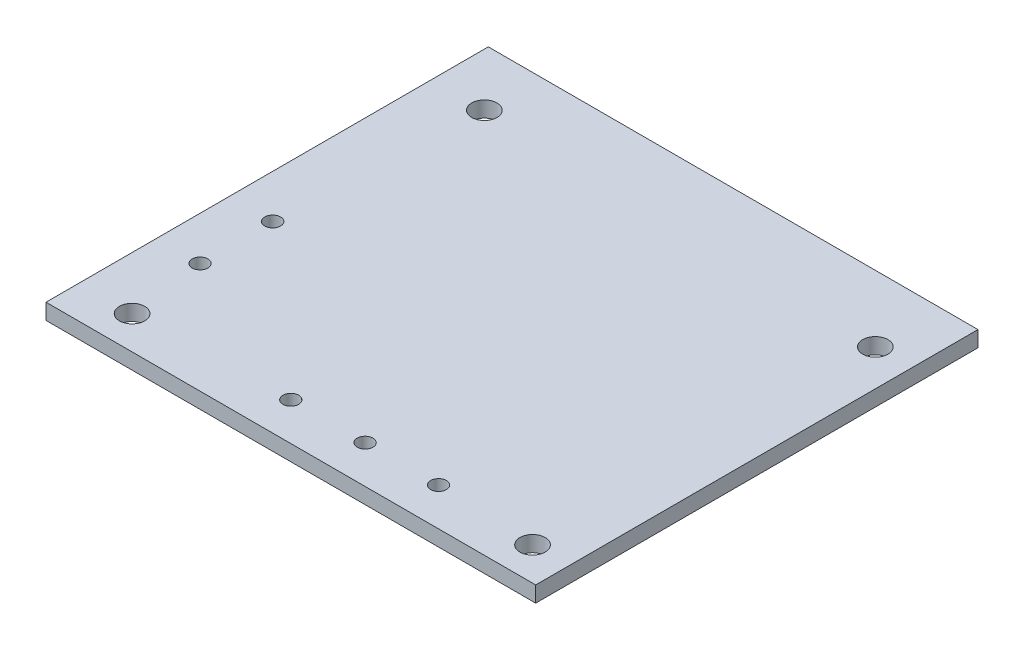
ISO-10303-21;
HEADER;
FILE_DESCRIPTION(('STEP AP214'),'2;1');
FILE_NAME('part.step','',(''),(''),'','','');
FILE_SCHEMA(('AUTOMOTIVE_DESIGN { 1 0 10303 214 1 1 1 1 }'));
ENDSEC;
DATA;
#1=APPLICATION_CONTEXT('core data for automotive mechanical design processes');
#2=APPLICATION_PROTOCOL_DEFINITION('international standard','automotive_design',2000,#1);
#3=PRODUCT_CONTEXT('',#1,'mechanical');
#4=PRODUCT('Part','Part','',(#3));
#5=PRODUCT_RELATED_PRODUCT_CATEGORY('part','',(#4));
#6=PRODUCT_DEFINITION_FORMATION('','',#4);
#7=PRODUCT_DEFINITION_CONTEXT('part definition',#1,'design');
#8=PRODUCT_DEFINITION('design','',#6,#7);
#9=PRODUCT_DEFINITION_SHAPE('','',#8);
#10=(LENGTH_UNIT() NAMED_UNIT(*) SI_UNIT(.MILLI.,.METRE.));
#11=(NAMED_UNIT(*) PLANE_ANGLE_UNIT() SI_UNIT($,.RADIAN.));
#12=(NAMED_UNIT(*) SI_UNIT($,.STERADIAN.) SOLID_ANGLE_UNIT());
#13=UNCERTAINTY_MEASURE_WITH_UNIT(LENGTH_MEASURE(1.E-05),#10,'distance_accuracy_value','');
#14=(GEOMETRIC_REPRESENTATION_CONTEXT(3) GLOBAL_UNCERTAINTY_ASSIGNED_CONTEXT((#13)) GLOBAL_UNIT_ASSIGNED_CONTEXT((#10,
#11,#12)) REPRESENTATION_CONTEXT('',''));
#15=CARTESIAN_POINT('',(0.,0.,0.));
#16=DIRECTION('',(0.,0.,1.));
#17=DIRECTION('',(1.,0.,0.));
#18=AXIS2_PLACEMENT_3D('',#15,#16,#17);
#19=CARTESIAN_POINT('',(0.,2.,0.));
#20=DIRECTION('',(1.,0.,0.));
#21=DIRECTION('',(0.,0.,-1.));
#22=AXIS2_PLACEMENT_3D('',#19,#20,#21);
#23=PLANE('',#22);
#24=DIRECTION('',(0.,0.,1.));
#25=VECTOR('',#24,1.);
#26=CARTESIAN_POINT('',(0.,0.,0.));
#27=LINE('',#26,#25);
#28=CARTESIAN_POINT('',(0.,0.,0.));
#29=VERTEX_POINT('',#28);
#30=CARTESIAN_POINT('',(0.,0.,56.));
#31=VERTEX_POINT('',#30);
#32=EDGE_CURVE('E102',#29,#31,#27,.T.);
#33=ORIENTED_EDGE('',*,*,#32,.T.);
#34=DIRECTION('',(0.,-1.,0.));
#35=VECTOR('',#34,1.);
#36=CARTESIAN_POINT('',(0.,2.,56.));
#37=LINE('',#36,#35);
#38=CARTESIAN_POINT('',(0.,2.,56.));
#39=VERTEX_POINT('',#38);
#40=EDGE_CURVE('E11',#39,#31,#37,.T.);
#41=ORIENTED_EDGE('',*,*,#40,.F.);
#42=DIRECTION('',(0.,0.,1.));
#43=VECTOR('',#42,1.);
#44=CARTESIAN_POINT('',(0.,2.,0.));
#45=LINE('',#44,#43);
#46=CARTESIAN_POINT('',(0.,2.,0.));
#47=VERTEX_POINT('',#46);
#48=EDGE_CURVE('E90',#47,#39,#45,.T.);
#49=ORIENTED_EDGE('',*,*,#48,.F.);
#50=DIRECTION('',(0.,-1.,0.));
#51=VECTOR('',#50,1.);
#52=CARTESIAN_POINT('',(0.,2.,0.));
#53=LINE('',#52,#51);
#54=EDGE_CURVE('E98',#47,#29,#53,.T.);
#55=ORIENTED_EDGE('',*,*,#54,.T.);
#56=EDGE_LOOP('',(#33,#41,#49,#55));
#57=FACE_BOUND('',#56,.T.);
#58=ADVANCED_FACE('F39',(#57),#23,.F.);
#59=CARTESIAN_POINT('',(0.,2.,56.));
#60=DIRECTION('',(0.,0.,-1.));
#61=DIRECTION('',(-1.,0.,0.));
#62=AXIS2_PLACEMENT_3D('',#59,#60,#61);
#63=PLANE('',#62);
#64=DIRECTION('',(1.,0.,0.));
#65=VECTOR('',#64,1.);
#66=CARTESIAN_POINT('',(0.,0.,56.));
#67=LINE('',#66,#65);
#68=CARTESIAN_POINT('',(62.,0.,56.));
#69=VERTEX_POINT('',#68);
#70=EDGE_CURVE('E94',#31,#69,#67,.T.);
#71=ORIENTED_EDGE('',*,*,#70,.T.);
#72=DIRECTION('',(0.,-1.,0.));
#73=VECTOR('',#72,1.);
#74=CARTESIAN_POINT('',(62.,2.,56.));
#75=LINE('',#74,#73);
#76=CARTESIAN_POINT('',(62.,2.,56.));
#77=VERTEX_POINT('',#76);
#78=EDGE_CURVE('E47',#77,#69,#75,.T.);
#79=ORIENTED_EDGE('',*,*,#78,.F.);
#80=DIRECTION('',(1.,0.,0.));
#81=VECTOR('',#80,1.);
#82=CARTESIAN_POINT('',(0.,2.,56.));
#83=LINE('',#82,#81);
#84=EDGE_CURVE('E85',#39,#77,#83,.T.);
#85=ORIENTED_EDGE('',*,*,#84,.F.);
#86=ORIENTED_EDGE('',*,*,#40,.T.);
#87=EDGE_LOOP('',(#71,#79,#85,#86));
#88=FACE_BOUND('',#87,.T.);
#89=ADVANCED_FACE('F93',(#88),#63,.F.);
#90=CARTESIAN_POINT('',(62.,2.,0.));
#91=DIRECTION('',(-1.,0.,0.));
#92=DIRECTION('',(0.,0.,1.));
#93=AXIS2_PLACEMENT_3D('',#90,#91,#92);
#94=PLANE('',#93);
#95=DIRECTION('',(0.,0.,-1.));
#96=VECTOR('',#95,1.);
#97=CARTESIAN_POINT('',(62.,0.,0.));
#98=LINE('',#97,#96);
#99=CARTESIAN_POINT('',(62.,0.,0.));
#100=VERTEX_POINT('',#99);
#101=EDGE_CURVE('E72',#69,#100,#98,.T.);
#102=ORIENTED_EDGE('',*,*,#101,.T.);
#103=DIRECTION('',(0.,-1.,0.));
#104=VECTOR('',#103,1.);
#105=CARTESIAN_POINT('',(62.,2.,0.));
#106=LINE('',#105,#104);
#107=CARTESIAN_POINT('',(62.,2.,0.));
#108=VERTEX_POINT('',#107);
#109=EDGE_CURVE('E95',#108,#100,#106,.T.);
#110=ORIENTED_EDGE('',*,*,#109,.F.);
#111=DIRECTION('',(0.,0.,-1.));
#112=VECTOR('',#111,1.);
#113=CARTESIAN_POINT('',(62.,2.,0.));
#114=LINE('',#113,#112);
#115=EDGE_CURVE('E88',#77,#108,#114,.T.);
#116=ORIENTED_EDGE('',*,*,#115,.F.);
#117=ORIENTED_EDGE('',*,*,#78,.T.);
#118=EDGE_LOOP('',(#102,#110,#116,#117));
#119=FACE_BOUND('',#118,.T.);
#120=ADVANCED_FACE('F96',(#119),#94,.F.);
#121=CARTESIAN_POINT('',(0.,2.,0.));
#122=DIRECTION('',(0.,0.,1.));
#123=DIRECTION('',(1.,0.,0.));
#124=AXIS2_PLACEMENT_3D('',#121,#122,#123);
#125=PLANE('',#124);
#126=DIRECTION('',(-1.,0.,0.));
#127=VECTOR('',#126,1.);
#128=CARTESIAN_POINT('',(0.,0.,0.));
#129=LINE('',#128,#127);
#130=EDGE_CURVE('E78',#100,#29,#129,.T.);
#131=ORIENTED_EDGE('',*,*,#130,.T.);
#132=ORIENTED_EDGE('',*,*,#54,.F.);
#133=DIRECTION('',(-1.,0.,0.));
#134=VECTOR('',#133,1.);
#135=CARTESIAN_POINT('',(0.,2.,0.));
#136=LINE('',#135,#134);
#137=EDGE_CURVE('E55',#108,#47,#136,.T.);
#138=ORIENTED_EDGE('',*,*,#137,.F.);
#139=ORIENTED_EDGE('',*,*,#109,.T.);
#140=EDGE_LOOP('',(#131,#132,#138,#139));
#141=FACE_BOUND('',#140,.T.);
#142=ADVANCED_FACE('F110',(#141),#125,.F.);
#143=CARTESIAN_POINT('',(0.,2.,0.));
#144=DIRECTION('',(0.,1.,0.));
#145=DIRECTION('',(0.,0.,1.));
#146=AXIS2_PLACEMENT_3D('',#143,#144,#145);
#147=PLANE('',#146);
#148=CARTESIAN_POINT('',(5.5,2.,32.8));
#149=DIRECTION('',(0.,1.,0.));
#150=DIRECTION('',(0.,0.,1.));
#151=AXIS2_PLACEMENT_3D('',#148,#149,#150);
#152=CIRCLE('',#151,1.);
#153=CARTESIAN_POINT('',(5.5,2.,33.8));
#154=VERTEX_POINT('',#153);
#155=EDGE_CURVE('E164',#154,#154,#152,.T.);
#156=ORIENTED_EDGE('',*,*,#155,.F.);
#157=EDGE_LOOP('',(#156));
#158=FACE_BOUND('',#157,.T.);
#159=CARTESIAN_POINT('',(5.5,2.,42.));
#160=DIRECTION('',(0.,1.,0.));
#161=DIRECTION('',(0.,0.,1.));
#162=AXIS2_PLACEMENT_3D('',#159,#160,#161);
#163=CIRCLE('',#162,1.);
#164=CARTESIAN_POINT('',(5.5,2.,43.));
#165=VERTEX_POINT('',#164);
#166=EDGE_CURVE('E158',#165,#165,#163,.T.);
#167=ORIENTED_EDGE('',*,*,#166,.F.);
#168=EDGE_LOOP('',(#167));
#169=FACE_BOUND('',#168,.T.);
#170=CARTESIAN_POINT('',(26.2,2.,51.2));
#171=DIRECTION('',(0.,1.,0.));
#172=DIRECTION('',(0.,0.,1.));
#173=AXIS2_PLACEMENT_3D('',#170,#171,#172);
#174=CIRCLE('',#173,1.);
#175=CARTESIAN_POINT('',(26.2,2.,52.2));
#176=VERTEX_POINT('',#175);
#177=EDGE_CURVE('E152',#176,#176,#174,.T.);
#178=ORIENTED_EDGE('',*,*,#177,.F.);
#179=EDGE_LOOP('',(#178));
#180=FACE_BOUND('',#179,.T.);
#181=CARTESIAN_POINT('',(35.6,2.,51.2));
#182=DIRECTION('',(0.,1.,0.));
#183=DIRECTION('',(0.,0.,1.));
#184=AXIS2_PLACEMENT_3D('',#181,#182,#183);
#185=CIRCLE('',#184,0.999999999999998);
#186=CARTESIAN_POINT('',(35.6,2.,52.2));
#187=VERTEX_POINT('',#186);
#188=EDGE_CURVE('E146',#187,#187,#185,.T.);
#189=ORIENTED_EDGE('',*,*,#188,.F.);
#190=EDGE_LOOP('',(#189));
#191=FACE_BOUND('',#190,.T.);
#192=CARTESIAN_POINT('',(44.9,2.,51.2));
#193=DIRECTION('',(0.,1.,0.));
#194=DIRECTION('',(0.,0.,1.));
#195=AXIS2_PLACEMENT_3D('',#192,#193,#194);
#196=CIRCLE('',#195,0.999999999999998);
#197=CARTESIAN_POINT('',(44.9,2.,52.2));
#198=VERTEX_POINT('',#197);
#199=EDGE_CURVE('E140',#198,#198,#196,.T.);
#200=ORIENTED_EDGE('',*,*,#199,.F.);
#201=EDGE_LOOP('',(#200));
#202=FACE_BOUND('',#201,.T.);
#203=CARTESIAN_POINT('',(57.4,2.,8.4));
#204=DIRECTION('',(0.,1.,0.));
#205=DIRECTION('',(0.,0.,1.));
#206=AXIS2_PLACEMENT_3D('',#203,#204,#205);
#207=CIRCLE('',#206,1.6);
#208=CARTESIAN_POINT('',(57.4,2.,10.));
#209=VERTEX_POINT('',#208);
#210=EDGE_CURVE('E122',#209,#209,#207,.T.);
#211=ORIENTED_EDGE('',*,*,#210,.F.);
#212=EDGE_LOOP('',(#211));
#213=FACE_BOUND('',#212,.T.);
#214=CARTESIAN_POINT('',(57.4,2.,51.8));
#215=DIRECTION('',(0.,1.,0.));
#216=DIRECTION('',(0.,0.,1.));
#217=AXIS2_PLACEMENT_3D('',#214,#215,#216);
#218=CIRCLE('',#217,1.6);
#219=CARTESIAN_POINT('',(57.4,2.,53.4));
#220=VERTEX_POINT('',#219);
#221=EDGE_CURVE('E129',#220,#220,#218,.T.);
#222=ORIENTED_EDGE('',*,*,#221,.F.);
#223=EDGE_LOOP('',(#222));
#224=FACE_BOUND('',#223,.T.);
#225=CARTESIAN_POINT('',(6.7,2.,51.8));
#226=DIRECTION('',(0.,1.,0.));
#227=DIRECTION('',(0.,0.,1.));
#228=AXIS2_PLACEMENT_3D('',#225,#226,#227);
#229=CIRCLE('',#228,1.60000000000001);
#230=CARTESIAN_POINT('',(6.7,2.,53.4));
#231=VERTEX_POINT('',#230);
#232=EDGE_CURVE('E135',#231,#231,#229,.T.);
#233=ORIENTED_EDGE('',*,*,#232,.F.);
#234=EDGE_LOOP('',(#233));
#235=FACE_BOUND('',#234,.T.);
#236=CARTESIAN_POINT('',(6.7,2.,7.2));
#237=DIRECTION('',(0.,1.,0.));
#238=DIRECTION('',(0.,0.,1.));
#239=AXIS2_PLACEMENT_3D('',#236,#237,#238);
#240=CIRCLE('',#239,1.6);
#241=CARTESIAN_POINT('',(6.7,2.,8.8));
#242=VERTEX_POINT('',#241);
#243=EDGE_CURVE('E116',#242,#242,#240,.T.);
#244=ORIENTED_EDGE('',*,*,#243,.F.);
#245=EDGE_LOOP('',(#244));
#246=FACE_BOUND('',#245,.T.);
#247=ORIENTED_EDGE('',*,*,#48,.T.);
#248=ORIENTED_EDGE('',*,*,#84,.T.);
#249=ORIENTED_EDGE('',*,*,#115,.T.);
#250=ORIENTED_EDGE('',*,*,#137,.T.);
#251=EDGE_LOOP('',(#247,#248,#249,#250));
#252=FACE_BOUND('',#251,.T.);
#253=ADVANCED_FACE('F86',(#158,#169,#180,#191,#202,#213,#224,#235,#246,#252),#147,.T.);
#254=CARTESIAN_POINT('',(0.,0.,0.));
#255=DIRECTION('',(0.,1.,0.));
#256=DIRECTION('',(0.,0.,1.));
#257=AXIS2_PLACEMENT_3D('',#254,#255,#256);
#258=PLANE('',#257);
#259=CARTESIAN_POINT('',(5.5,0.,32.8));
#260=DIRECTION('',(0.,1.,0.));
#261=DIRECTION('',(0.,0.,1.));
#262=AXIS2_PLACEMENT_3D('',#259,#260,#261);
#263=CIRCLE('',#262,1.);
#264=CARTESIAN_POINT('',(5.5,0.,33.8));
#265=VERTEX_POINT('',#264);
#266=EDGE_CURVE('E126',#265,#265,#263,.T.);
#267=ORIENTED_EDGE('',*,*,#266,.T.);
#268=EDGE_LOOP('',(#267));
#269=FACE_BOUND('',#268,.T.);
#270=CARTESIAN_POINT('',(5.5,0.,42.));
#271=DIRECTION('',(0.,1.,0.));
#272=DIRECTION('',(0.,0.,1.));
#273=AXIS2_PLACEMENT_3D('',#270,#271,#272);
#274=CIRCLE('',#273,1.);
#275=CARTESIAN_POINT('',(5.5,0.,43.));
#276=VERTEX_POINT('',#275);
#277=EDGE_CURVE('E161',#276,#276,#274,.T.);
#278=ORIENTED_EDGE('',*,*,#277,.T.);
#279=EDGE_LOOP('',(#278));
#280=FACE_BOUND('',#279,.T.);
#281=CARTESIAN_POINT('',(26.2,0.,51.2));
#282=DIRECTION('',(0.,1.,0.));
#283=DIRECTION('',(0.,0.,1.));
#284=AXIS2_PLACEMENT_3D('',#281,#282,#283);
#285=CIRCLE('',#284,1.);
#286=CARTESIAN_POINT('',(26.2,0.,52.2));
#287=VERTEX_POINT('',#286);
#288=EDGE_CURVE('E155',#287,#287,#285,.T.);
#289=ORIENTED_EDGE('',*,*,#288,.T.);
#290=EDGE_LOOP('',(#289));
#291=FACE_BOUND('',#290,.T.);
#292=CARTESIAN_POINT('',(35.6,0.,51.2));
#293=DIRECTION('',(0.,1.,0.));
#294=DIRECTION('',(0.,0.,1.));
#295=AXIS2_PLACEMENT_3D('',#292,#293,#294);
#296=CIRCLE('',#295,0.999999999999998);
#297=CARTESIAN_POINT('',(35.6,0.,52.2));
#298=VERTEX_POINT('',#297);
#299=EDGE_CURVE('E149',#298,#298,#296,.T.);
#300=ORIENTED_EDGE('',*,*,#299,.T.);
#301=EDGE_LOOP('',(#300));
#302=FACE_BOUND('',#301,.T.);
#303=CARTESIAN_POINT('',(44.9,0.,51.2));
#304=DIRECTION('',(0.,1.,0.));
#305=DIRECTION('',(0.,0.,1.));
#306=AXIS2_PLACEMENT_3D('',#303,#304,#305);
#307=CIRCLE('',#306,0.999999999999998);
#308=CARTESIAN_POINT('',(44.9,0.,52.2));
#309=VERTEX_POINT('',#308);
#310=EDGE_CURVE('E143',#309,#309,#307,.T.);
#311=ORIENTED_EDGE('',*,*,#310,.T.);
#312=EDGE_LOOP('',(#311));
#313=FACE_BOUND('',#312,.T.);
#314=CARTESIAN_POINT('',(57.4,0.,8.4));
#315=DIRECTION('',(0.,1.,0.));
#316=DIRECTION('',(0.,0.,1.));
#317=AXIS2_PLACEMENT_3D('',#314,#315,#316);
#318=CIRCLE('',#317,1.6);
#319=CARTESIAN_POINT('',(57.4,0.,10.));
#320=VERTEX_POINT('',#319);
#321=EDGE_CURVE('E125',#320,#320,#318,.T.);
#322=ORIENTED_EDGE('',*,*,#321,.T.);
#323=EDGE_LOOP('',(#322));
#324=FACE_BOUND('',#323,.T.);
#325=CARTESIAN_POINT('',(57.4,0.,51.8));
#326=DIRECTION('',(0.,1.,0.));
#327=DIRECTION('',(0.,0.,1.));
#328=AXIS2_PLACEMENT_3D('',#325,#326,#327);
#329=CIRCLE('',#328,1.6);
#330=CARTESIAN_POINT('',(57.4,0.,53.4));
#331=VERTEX_POINT('',#330);
#332=EDGE_CURVE('E132',#331,#331,#329,.T.);
#333=ORIENTED_EDGE('',*,*,#332,.T.);
#334=EDGE_LOOP('',(#333));
#335=FACE_BOUND('',#334,.T.);
#336=CARTESIAN_POINT('',(6.7,0.,51.8));
#337=DIRECTION('',(0.,1.,0.));
#338=DIRECTION('',(0.,0.,1.));
#339=AXIS2_PLACEMENT_3D('',#336,#337,#338);
#340=CIRCLE('',#339,1.60000000000001);
#341=CARTESIAN_POINT('',(6.7,0.,53.4));
#342=VERTEX_POINT('',#341);
#343=EDGE_CURVE('E119',#342,#342,#340,.T.);
#344=ORIENTED_EDGE('',*,*,#343,.T.);
#345=EDGE_LOOP('',(#344));
#346=FACE_BOUND('',#345,.T.);
#347=CARTESIAN_POINT('',(6.7,0.,7.2));
#348=DIRECTION('',(0.,1.,0.));
#349=DIRECTION('',(0.,0.,1.));
#350=AXIS2_PLACEMENT_3D('',#347,#348,#349);
#351=CIRCLE('',#350,1.6);
#352=CARTESIAN_POINT('',(6.7,0.,8.8));
#353=VERTEX_POINT('',#352);
#354=EDGE_CURVE('E105',#353,#353,#351,.T.);
#355=ORIENTED_EDGE('',*,*,#354,.T.);
#356=EDGE_LOOP('',(#355));
#357=FACE_BOUND('',#356,.T.);
#358=ORIENTED_EDGE('',*,*,#32,.F.);
#359=ORIENTED_EDGE('',*,*,#130,.F.);
#360=ORIENTED_EDGE('',*,*,#101,.F.);
#361=ORIENTED_EDGE('',*,*,#70,.F.);
#362=EDGE_LOOP('',(#358,#359,#360,#361));
#363=FACE_BOUND('',#362,.T.);
#364=ADVANCED_FACE('F113',(#269,#280,#291,#302,#313,#324,#335,#346,#357,#363),#258,.F.);
#365=CARTESIAN_POINT('',(6.7,0.,7.2));
#366=DIRECTION('',(0.,1.,0.));
#367=DIRECTION('',(0.,0.,1.));
#368=AXIS2_PLACEMENT_3D('',#365,#366,#367);
#369=CYLINDRICAL_SURFACE('',#368,1.6);
#370=ORIENTED_EDGE('',*,*,#354,.F.);
#371=EDGE_LOOP('',(#370));
#372=FACE_BOUND('',#371,.T.);
#373=ORIENTED_EDGE('',*,*,#243,.T.);
#374=EDGE_LOOP('',(#373));
#375=FACE_BOUND('',#374,.T.);
#376=ADVANCED_FACE('F198',(#372,#375),#369,.F.);
#377=CARTESIAN_POINT('',(6.7,0.,51.8));
#378=DIRECTION('',(0.,1.,0.));
#379=DIRECTION('',(0.,0.,1.));
#380=AXIS2_PLACEMENT_3D('',#377,#378,#379);
#381=CYLINDRICAL_SURFACE('',#380,1.60000000000001);
#382=ORIENTED_EDGE('',*,*,#343,.F.);
#383=EDGE_LOOP('',(#382));
#384=FACE_BOUND('',#383,.T.);
#385=ORIENTED_EDGE('',*,*,#232,.T.);
#386=EDGE_LOOP('',(#385));
#387=FACE_BOUND('',#386,.T.);
#388=ADVANCED_FACE('F200',(#384,#387),#381,.F.);
#389=CARTESIAN_POINT('',(57.4,0.,51.8));
#390=DIRECTION('',(0.,1.,0.));
#391=DIRECTION('',(0.,0.,1.));
#392=AXIS2_PLACEMENT_3D('',#389,#390,#391);
#393=CYLINDRICAL_SURFACE('',#392,1.6);
#394=ORIENTED_EDGE('',*,*,#332,.F.);
#395=EDGE_LOOP('',(#394));
#396=FACE_BOUND('',#395,.T.);
#397=ORIENTED_EDGE('',*,*,#221,.T.);
#398=EDGE_LOOP('',(#397));
#399=FACE_BOUND('',#398,.T.);
#400=ADVANCED_FACE('F207',(#396,#399),#393,.F.);
#401=CARTESIAN_POINT('',(57.4,0.,8.4));
#402=DIRECTION('',(0.,1.,0.));
#403=DIRECTION('',(0.,0.,1.));
#404=AXIS2_PLACEMENT_3D('',#401,#402,#403);
#405=CYLINDRICAL_SURFACE('',#404,1.6);
#406=ORIENTED_EDGE('',*,*,#321,.F.);
#407=EDGE_LOOP('',(#406));
#408=FACE_BOUND('',#407,.T.);
#409=ORIENTED_EDGE('',*,*,#210,.T.);
#410=EDGE_LOOP('',(#409));
#411=FACE_BOUND('',#410,.T.);
#412=ADVANCED_FACE('F248',(#408,#411),#405,.F.);
#413=CARTESIAN_POINT('',(44.9,0.,51.2));
#414=DIRECTION('',(0.,1.,0.));
#415=DIRECTION('',(0.,0.,1.));
#416=AXIS2_PLACEMENT_3D('',#413,#414,#415);
#417=CYLINDRICAL_SURFACE('',#416,0.999999999999998);
#418=ORIENTED_EDGE('',*,*,#310,.F.);
#419=EDGE_LOOP('',(#418));
#420=FACE_BOUND('',#419,.T.);
#421=ORIENTED_EDGE('',*,*,#199,.T.);
#422=EDGE_LOOP('',(#421));
#423=FACE_BOUND('',#422,.T.);
#424=ADVANCED_FACE('F242',(#420,#423),#417,.F.);
#425=CARTESIAN_POINT('',(35.6,0.,51.2));
#426=DIRECTION('',(0.,1.,0.));
#427=DIRECTION('',(0.,0.,1.));
#428=AXIS2_PLACEMENT_3D('',#425,#426,#427);
#429=CYLINDRICAL_SURFACE('',#428,0.999999999999998);
#430=ORIENTED_EDGE('',*,*,#299,.F.);
#431=EDGE_LOOP('',(#430));
#432=FACE_BOUND('',#431,.T.);
#433=ORIENTED_EDGE('',*,*,#188,.T.);
#434=EDGE_LOOP('',(#433));
#435=FACE_BOUND('',#434,.T.);
#436=ADVANCED_FACE('F247',(#432,#435),#429,.F.);
#437=CARTESIAN_POINT('',(26.2,0.,51.2));
#438=DIRECTION('',(0.,1.,0.));
#439=DIRECTION('',(0.,0.,1.));
#440=AXIS2_PLACEMENT_3D('',#437,#438,#439);
#441=CYLINDRICAL_SURFACE('',#440,1.);
#442=ORIENTED_EDGE('',*,*,#288,.F.);
#443=EDGE_LOOP('',(#442));
#444=FACE_BOUND('',#443,.T.);
#445=ORIENTED_EDGE('',*,*,#177,.T.);
#446=EDGE_LOOP('',(#445));
#447=FACE_BOUND('',#446,.T.);
#448=ADVANCED_FACE('F261',(#444,#447),#441,.F.);
#449=CARTESIAN_POINT('',(5.5,0.,42.));
#450=DIRECTION('',(0.,1.,0.));
#451=DIRECTION('',(0.,0.,1.));
#452=AXIS2_PLACEMENT_3D('',#449,#450,#451);
#453=CYLINDRICAL_SURFACE('',#452,1.);
#454=ORIENTED_EDGE('',*,*,#277,.F.);
#455=EDGE_LOOP('',(#454));
#456=FACE_BOUND('',#455,.T.);
#457=ORIENTED_EDGE('',*,*,#166,.T.);
#458=EDGE_LOOP('',(#457));
#459=FACE_BOUND('',#458,.T.);
#460=ADVANCED_FACE('F175',(#456,#459),#453,.F.);
#461=CARTESIAN_POINT('',(5.5,0.,32.8));
#462=DIRECTION('',(0.,1.,0.));
#463=DIRECTION('',(0.,0.,1.));
#464=AXIS2_PLACEMENT_3D('',#461,#462,#463);
#465=CYLINDRICAL_SURFACE('',#464,1.);
#466=ORIENTED_EDGE('',*,*,#266,.F.);
#467=EDGE_LOOP('',(#466));
#468=FACE_BOUND('',#467,.T.);
#469=ORIENTED_EDGE('',*,*,#155,.T.);
#470=EDGE_LOOP('',(#469));
#471=FACE_BOUND('',#470,.T.);
#472=ADVANCED_FACE('F172',(#468,#471),#465,.F.);
#473=CLOSED_SHELL('',(#58,#89,#120,#142,#253,#364,#376,#388,#400,#412,#424,#436,#448,#460,#472));
#474=MANIFOLD_SOLID_BREP('B2',#473);
#475=ADVANCED_BREP_SHAPE_REPRESENTATION('',(#18,#474),#14);
#476=SHAPE_DEFINITION_REPRESENTATION(#9,#475);
ENDSEC;
END-ISO-10303-21;
